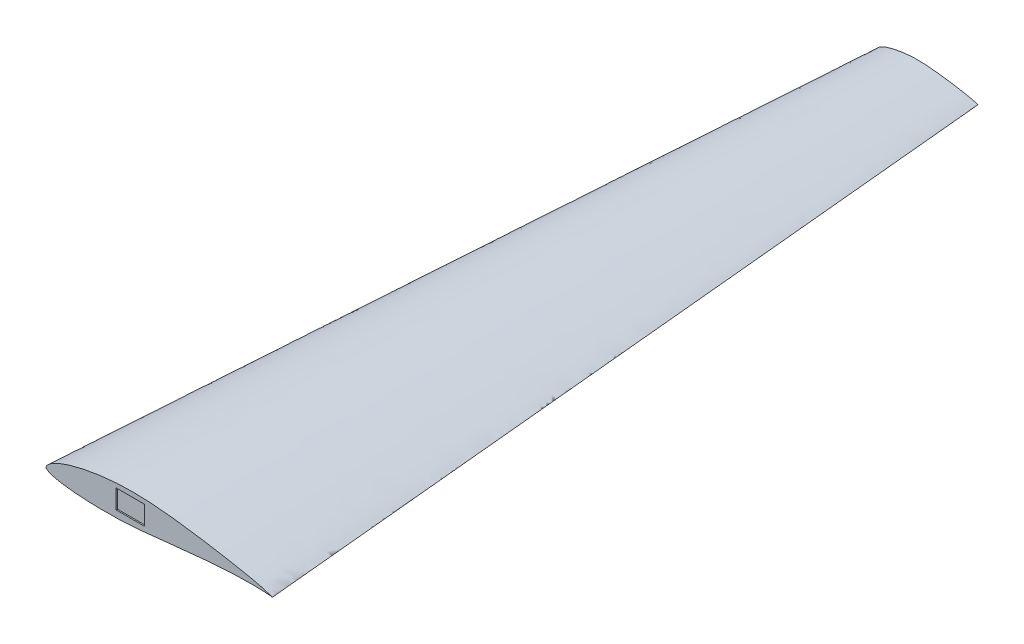
ISO-10303-21;
HEADER;
FILE_DESCRIPTION(('STEP AP214'),'2;1');
FILE_NAME('part.step','',(''),(''),'','','');
FILE_SCHEMA(('AUTOMOTIVE_DESIGN { 1 0 10303 214 1 1 1 1 }'));
ENDSEC;
DATA;
#1=APPLICATION_CONTEXT('core data for automotive mechanical design processes');
#2=APPLICATION_PROTOCOL_DEFINITION('international standard','automotive_design',2000,#1);
#3=PRODUCT_CONTEXT('',#1,'mechanical');
#4=PRODUCT('Part','Part','',(#3));
#5=PRODUCT_RELATED_PRODUCT_CATEGORY('part','',(#4));
#6=PRODUCT_DEFINITION_FORMATION('','',#4);
#7=PRODUCT_DEFINITION_CONTEXT('part definition',#1,'design');
#8=PRODUCT_DEFINITION('design','',#6,#7);
#9=PRODUCT_DEFINITION_SHAPE('','',#8);
#10=(LENGTH_UNIT() NAMED_UNIT(*) SI_UNIT(.MILLI.,.METRE.));
#11=(NAMED_UNIT(*) PLANE_ANGLE_UNIT() SI_UNIT($,.RADIAN.));
#12=(NAMED_UNIT(*) SI_UNIT($,.STERADIAN.) SOLID_ANGLE_UNIT());
#13=UNCERTAINTY_MEASURE_WITH_UNIT(LENGTH_MEASURE(1.E-05),#10,'distance_accuracy_value','');
#14=(GEOMETRIC_REPRESENTATION_CONTEXT(3) GLOBAL_UNCERTAINTY_ASSIGNED_CONTEXT((#13)) GLOBAL_UNIT_ASSIGNED_CONTEXT((#10,
#11,#12)) REPRESENTATION_CONTEXT('',''));
#15=CARTESIAN_POINT('',(0.,0.,0.));
#16=DIRECTION('',(0.,0.,1.));
#17=DIRECTION('',(1.,0.,0.));
#18=AXIS2_PLACEMENT_3D('',#15,#16,#17);
#19=CARTESIAN_POINT('',(-1154.67997113277,-18.9639866159089,-20.));
#20=DIRECTION('',(0.,0.,1.));
#21=DIRECTION('',(-1.,0.,0.));
#22=AXIS2_PLACEMENT_3D('',#19,#20,#21);
#23=PLANE('',#22);
#24=CARTESIAN_POINT('',(637.205898192704,-30.8287655417815,-20.));
#25=CARTESIAN_POINT('',(637.201899095165,-30.6617141837894,-20.));
#26=CARTESIAN_POINT('',(624.340560361227,-27.2829794764373,-20.));
#27=CARTESIAN_POINT('',(612.180848443958,-22.4384339408856,-20.));
#28=CARTESIAN_POINT('',(584.1934966163,-12.9236065949599,-20.));
#29=CARTESIAN_POINT('',(550.573388405335,-3.00306264153049,-20.));
#30=CARTESIAN_POINT('',(507.031775344727,7.31757291672287,-20.));
#31=CARTESIAN_POINT('',(455.545202677299,18.4127610030455,-20.));
#32=CARTESIAN_POINT('',(396.045342981437,30.4121098513646,-20.));
#33=CARTESIAN_POINT('',(329.608830024776,43.1367783526144,-20.));
#34=CARTESIAN_POINT('',(257.103677447065,56.3698310078444,-20.));
#35=CARTESIAN_POINT('',(179.566044984712,69.8811959522331,-20.));
#36=CARTESIAN_POINT('',(98.0040149305177,83.2871979527405,-20.));
#37=CARTESIAN_POINT('',(13.4916001870969,96.2741526462915,-20.));
#38=CARTESIAN_POINT('',(-72.9444245741009,108.416502290215,-20.));
#39=CARTESIAN_POINT('',(-160.276589340614,119.243860555077,-20.));
#40=CARTESIAN_POINT('',(-247.524811414299,128.361079009185,-20.));
#41=CARTESIAN_POINT('',(-333.850816491668,135.206641048699,-20.));
#42=CARTESIAN_POINT('',(-418.62279166819,139.050084763409,-20.));
#43=CARTESIAN_POINT('',(-501.360886667318,139.671030910781,-20.));
#44=CARTESIAN_POINT('',(-581.716263489697,136.885357982169,-20.));
#45=CARTESIAN_POINT('',(-659.296624774083,130.867982416211,-20.));
#46=CARTESIAN_POINT('',(-733.606389984446,122.220462802317,-20.));
#47=CARTESIAN_POINT('',(-804.005192472441,111.471174797557,-20.));
#48=CARTESIAN_POINT('',(-869.742959712326,98.8183249705576,-20.));
#49=CARTESIAN_POINT('',(-930.149362586197,84.6626316298686,-20.));
#50=CARTESIAN_POINT('',(-984.604323928922,69.3091730998716,-20.));
#51=CARTESIAN_POINT('',(-1032.52610252396,53.0958706696138,-20.));
#52=CARTESIAN_POINT('',(-1073.44710571588,36.391875667701,-20.));
#53=CARTESIAN_POINT('',(-1106.97281951812,19.4367425763099,-20.));
#54=CARTESIAN_POINT('',(-1132.81440521732,2.65228106861395,-20.));
#55=CARTESIAN_POINT('',(-1147.69800566304,-10.4496016700711,-20.));
#56=CARTESIAN_POINT('',(-1155.93792618086,-20.4072267704912,-20.));
#57=CARTESIAN_POINT('',(-1159.73603262891,-26.1420092113419,-20.));
#58=CARTESIAN_POINT('',(-1162.29687404882,-32.2887637968773,-20.));
#59=CARTESIAN_POINT('',(-1163.02961498736,-36.0635081413664,-20.));
#60=CARTESIAN_POINT('',(-1162.88645541477,-38.7085659438932,-20.));
#61=CARTESIAN_POINT('',(-1161.82222186532,-41.1953992990109,-20.));
#62=CARTESIAN_POINT('',(-1159.33848344514,-44.3902386327544,-20.));
#63=CARTESIAN_POINT('',(-1154.04337356053,-49.2444985030971,-20.));
#64=CARTESIAN_POINT('',(-1143.54648919571,-55.9865112754625,-20.));
#65=CARTESIAN_POINT('',(-1124.17422283292,-64.496278877395,-20.));
#66=CARTESIAN_POINT('',(-1094.69974337827,-73.384985572832,-20.));
#67=CARTESIAN_POINT('',(-1055.14192052983,-81.756543547593,-20.));
#68=CARTESIAN_POINT('',(-1007.21961769442,-89.0071543211266,-20.));
#69=CARTESIAN_POINT('',(-951.470022218796,-95.2724233138396,-20.));
#70=CARTESIAN_POINT('',(-888.557803111172,-100.396692502895,-20.));
#71=CARTESIAN_POINT('',(-819.285797118707,-104.232978137697,-20.));
#72=CARTESIAN_POINT('',(-744.520854987428,-106.629067947558,-20.));
#73=CARTESIAN_POINT('',(-665.068638724127,-107.227734162227,-20.));
#74=CARTESIAN_POINT('',(-581.618577699989,-105.540984685579,-20.));
#75=CARTESIAN_POINT('',(-494.657700858437,-101.259128330527,-20.));
#76=CARTESIAN_POINT('',(-404.474359226252,-94.1471454469288,-20.));
#77=CARTESIAN_POINT('',(-311.376736229075,-84.5975961097064,-20.));
#78=CARTESIAN_POINT('',(-215.89334635615,-74.0273472659613,-20.));
#79=CARTESIAN_POINT('',(-119.080288018422,-63.2442750785889,-20.));
#80=CARTESIAN_POINT('',(-22.3000935122685,-52.9711250135226,-20.));
#81=CARTESIAN_POINT('',(72.993589670017,-43.6696490132337,-20.));
#82=CARTESIAN_POINT('',(165.297776875109,-35.8584715469645,-20.));
#83=CARTESIAN_POINT('',(253.084648037599,-29.7869699753317,-20.));
#84=CARTESIAN_POINT('',(334.812275151983,-25.5512188260446,-20.));
#85=CARTESIAN_POINT('',(409.125030592602,-23.2680963711777,-20.));
#86=CARTESIAN_POINT('',(474.371672980515,-22.6259520258617,-20.));
#87=CARTESIAN_POINT('',(530.172780584082,-23.5565126327113,-20.));
#88=CARTESIAN_POINT('',(573.20612192453,-25.027782672938,-20.));
#89=CARTESIAN_POINT('',(608.39684892439,-27.7924208570704,-20.));
#90=CARTESIAN_POINT('',(622.966968367519,-28.6400352563432,-20.));
#91=CARTESIAN_POINT('',(637.210029137364,-31.001324452546,-20.));
#92=CARTESIAN_POINT('',(637.205898192704,-30.8287655417815,-20.));
#93=B_SPLINE_CURVE_WITH_KNOTS('',3,(#24,#25,#26,#27,#28,#29,#30,#31,#32,#33,#34,#35,#36,#37,#38,
#39,#40,#41,#42,#43,#44,#45,#46,#47,#48,#49,#50,#51,#52,#53,#54,#55,#56,#57,#58,#59,#60,#61,#62,
#63,#64,#65,#66,#67,#68,#69,#70,#71,#72,#73,#74,#75,#76,#77,#78,#79,#80,#81,#82,#83,#84,#85,#86,
#87,#88,#89,#90,#91,#92),.UNSPECIFIED.,.T.,.F.,(4,1,1,1,1,1,1,1,1,1,1,1,1,1,1,1,1,1,1,1,1,1,1,1,
1,1,1,1,1,1,1,1,1,1,1,1,1,1,1,1,1,1,1,1,1,1,1,1,1,1,1,1,1,1,1,1,1,1,1,1,1,1,1,1,1,1,4),(0.,
0.00178025429931348,0.00677661855276226,0.014307631931115,0.0240462466109695,0.0361164032384218,
0.0505469730630571,0.0671298835400742,0.0856244289456062,0.10576729194862,0.127282098412942,
0.149864114045041,0.173229760189317,0.197069077892929,0.221103034083199,0.245051957369849,
0.268663179942347,0.291772797822348,0.314298508345449,0.336177511433891,0.357377359215959,
0.377791670496789,0.397224888102935,0.415489312865215,0.432417328029751,0.447849235180273,
0.461650757544391,0.473686992386839,0.483898395757803,0.492262508108233,0.498796820958936,
0.499955027372734,0.502810607326279,0.504371243067385,0.50535998755193,0.505924933279694,
0.506503368203689,0.507535007041587,0.509204749770686,0.512345281497249,0.517665407870953,
0.526421681932562,0.537424925562334,0.550643204547595,0.565965823835836,0.583206168779579,
0.6021549785986,0.622586582637333,0.644254823208852,0.666997978581174,0.690702845759673,
0.715307475272001,0.740824202204505,0.767084355637659,0.793717038600972,0.82033109971691,
0.846519300878587,0.871863223081629,0.895937170924907,0.918334876492831,0.938667169413558,
0.956573464196435,0.971715275283217,0.983839006179547,0.992717916559063,0.998161052107173,1.),.UNSPECIFIED.);
#94=CARTESIAN_POINT('',(637.205898192704,-30.8287655417815,-20.));
#95=VERTEX_POINT('',#94);
#96=EDGE_CURVE('E63',#95,#95,#93,.T.);
#97=ORIENTED_EDGE('',*,*,#96,.T.);
#98=EDGE_LOOP('',(#97));
#99=FACE_BOUND('',#98,.T.);
#100=DIRECTION('',(-1.,0.,0.));
#101=VECTOR('',#100,1.);
#102=CARTESIAN_POINT('',(-378.662123766315,-50.9305698518282,-20.));
#103=LINE('',#102,#101);
#104=CARTESIAN_POINT('',(-378.662123766315,-50.9305698518282,-20.));
#105=VERTEX_POINT('',#104);
#106=CARTESIAN_POINT('',(-605.033690274723,-50.9305698518282,-20.));
#107=VERTEX_POINT('',#106);
#108=EDGE_CURVE('E101',#105,#107,#103,.T.);
#109=ORIENTED_EDGE('',*,*,#108,.T.);
#110=DIRECTION('',(0.,1.,0.));
#111=VECTOR('',#110,1.);
#112=CARTESIAN_POINT('',(-605.033690274723,100.87153945381,-20.));
#113=LINE('',#112,#111);
#114=CARTESIAN_POINT('',(-605.033690274723,100.87153945381,-20.));
#115=VERTEX_POINT('',#114);
#116=EDGE_CURVE('E78',#107,#115,#113,.T.);
#117=ORIENTED_EDGE('',*,*,#116,.T.);
#118=DIRECTION('',(1.,0.,0.));
#119=VECTOR('',#118,1.);
#120=CARTESIAN_POINT('',(-378.662123766315,100.87153945381,-20.));
#121=LINE('',#120,#119);
#122=CARTESIAN_POINT('',(-378.662123766315,100.87153945381,-20.));
#123=VERTEX_POINT('',#122);
#124=EDGE_CURVE('E141',#115,#123,#121,.T.);
#125=ORIENTED_EDGE('',*,*,#124,.T.);
#126=DIRECTION('',(0.,-1.,0.));
#127=VECTOR('',#126,1.);
#128=CARTESIAN_POINT('',(-378.662123766315,100.87153945381,-20.));
#129=LINE('',#128,#127);
#130=EDGE_CURVE('E129',#123,#105,#129,.T.);
#131=ORIENTED_EDGE('',*,*,#130,.T.);
#132=EDGE_LOOP('',(#109,#117,#125,#131));
#133=FACE_BOUND('',#132,.T.);
#134=ADVANCED_FACE('F50',(#99,#133),#23,.T.);
#135=CARTESIAN_POINT('',(-747.653077521207,-40.6182657315667,-6220.));
#136=DIRECTION('',(0.,0.,1.));
#137=DIRECTION('',(-1.,0.,0.));
#138=AXIS2_PLACEMENT_3D('',#135,#136,#137);
#139=PLANE('',#138);
#140=CARTESIAN_POINT('',(46.231204019507,-35.2354448345607,-6220.));
#141=CARTESIAN_POINT('',(46.2284405656363,-35.161464044046,-6220.));
#142=CARTESIAN_POINT('',(40.5107466597847,-33.7410304315181,-6220.));
#143=CARTESIAN_POINT('',(35.095173755005,-31.6670699807893,-6220.));
#144=CARTESIAN_POINT('',(22.6401533138637,-27.6181263346662,-6220.));
#145=CARTESIAN_POINT('',(7.68738653694873,-23.4228917248776,-6220.));
#146=CARTESIAN_POINT('',(-11.6630288456523,-19.1093216631822,-6220.));
#147=CARTESIAN_POINT('',(-34.5376973183015,-14.4997928532483,-6220.));
#148=CARTESIAN_POINT('',(-60.9676577726097,-9.5372939208794,-6220.));
#149=CARTESIAN_POINT('',(-90.4748945702333,-4.29466001199642,-6220.));
#150=CARTESIAN_POINT('',(-122.673585589033,1.13715909285272,-6220.));
#151=CARTESIAN_POINT('',(-157.103341203516,6.66239247620247,-6220.));
#152=CARTESIAN_POINT('',(-193.315298237174,12.1170555043395,-6220.));
#153=CARTESIAN_POINT('',(-230.831801501577,17.3685612770775,-6220.));
#154=CARTESIAN_POINT('',(-269.195458339637,22.2344819950382,-6220.));
#155=CARTESIAN_POINT('',(-307.948301893932,26.5125347132972,-6220.));
#156=CARTESIAN_POINT('',(-346.653804819708,30.0334858752315,-6220.));
#157=CARTESIAN_POINT('',(-384.937273776908,32.5535580846316,-6220.));
#158=CARTESIAN_POINT('',(-422.514475712798,33.7529045585345,-6220.));
#159=CARTESIAN_POINT('',(-459.17152624748,33.5367452774346,-6220.));
#160=CARTESIAN_POINT('',(-494.752795326995,31.8255847079449,-6220.));
#161=CARTESIAN_POINT('',(-529.085531914352,28.6992408412461,-6220.));
#162=CARTESIAN_POINT('',(-561.953763146873,24.4271493642645,-6220.));
#163=CARTESIAN_POINT('',(-593.076940726259,19.2471852213284,-6220.));
#164=CARTESIAN_POINT('',(-622.123955821754,13.2516082607377,-6220.));
#165=CARTESIAN_POINT('',(-648.800228679982,6.62191851956731,-6220.));
#166=CARTESIAN_POINT('',(-672.832873554333,-0.503051287442359,-6220.));
#167=CARTESIAN_POINT('',(-693.96618270177,-7.97014647053786,-6220.));
#168=CARTESIAN_POINT('',(-711.995202148996,-15.6130550209624,-6220.));
#169=CARTESIAN_POINT('',(-726.74658265942,-23.3233108305785,-6220.));
#170=CARTESIAN_POINT('',(-738.094871742379,-30.9123353139702,-6220.));
#171=CARTESIAN_POINT('',(-744.610586604553,-36.8048992419908,-6220.));
#172=CARTESIAN_POINT('',(-748.201788544685,-41.2650967461758,-6220.));
#173=CARTESIAN_POINT('',(-749.850318344285,-43.828182757875,-6220.));
#174=CARTESIAN_POINT('',(-750.94828793429,-46.5664283398626,-6220.));
#175=CARTESIAN_POINT('',(-751.250483793828,-48.2430082792743,-6220.));
#176=CARTESIAN_POINT('',(-751.171358916499,-49.4139312981977,-6220.));
#177=CARTESIAN_POINT('',(-750.685133378202,-50.5092914480428,-6220.));
#178=CARTESIAN_POINT('',(-749.565856882824,-51.9098735302076,-6220.));
#179=CARTESIAN_POINT('',(-747.191277168439,-54.0288947151431,-6220.));
#180=CARTESIAN_POINT('',(-742.501078818877,-56.9533147580623,-6220.));
#181=CARTESIAN_POINT('',(-733.868548954772,-60.6081626209987,-6220.));
#182=CARTESIAN_POINT('',(-720.75844147582,-64.3709023541952,-6220.));
#183=CARTESIAN_POINT('',(-703.184436093652,-67.8446748921428,-6220.));
#184=CARTESIAN_POINT('',(-681.911582287878,-70.772200095514,-6220.));
#185=CARTESIAN_POINT('',(-657.177051439535,-73.2167412462913,-6220.));
#186=CARTESIAN_POINT('',(-629.276219223052,-75.1132874538173,-6220.));
#187=CARTESIAN_POINT('',(-598.56561876685,-76.4014909147392,-6220.));
#188=CARTESIAN_POINT('',(-565.43017274413,-77.0190676374616,-6220.));
#189=CARTESIAN_POINT('',(-530.228914169513,-76.8125475071701,-6220.));
#190=CARTESIAN_POINT('',(-493.270160843118,-75.5698410912889,-6220.));
#191=CARTESIAN_POINT('',(-454.771507600199,-73.1566453823038,-6220.));
#192=CARTESIAN_POINT('',(-414.862090680234,-69.4705576020164,-6220.));
#193=CARTESIAN_POINT('',(-373.676106035862,-64.6873134822189,-6220.));
#194=CARTESIAN_POINT('',(-331.439275690689,-59.4377296716919,-6220.));
#195=CARTESIAN_POINT('',(-288.614659582081,-54.0859694749774,-6220.));
#196=CARTESIAN_POINT('',(-245.801574741511,-48.9603022904963,-6220.));
#197=CARTESIAN_POINT('',(-203.641252257449,-44.2739171415237,-6220.));
#198=CARTESIAN_POINT('',(-162.796442142331,-40.2654907769843,-6220.));
#199=CARTESIAN_POINT('',(-123.942495214821,-37.0545696704387,-6220.));
#200=CARTESIAN_POINT('',(-87.7619223828843,-34.6928701852552,-6220.));
#201=CARTESIAN_POINT('',(-54.8545790950461,-33.2402187187982,-6220.));
#202=CARTESIAN_POINT('',(-25.9538233844276,-32.5683565258773,-6220.));
#203=CARTESIAN_POINT('',(-1.22814621466564,-32.6492910205264,-6220.));
#204=CARTESIAN_POINT('',(17.844561028956,-33.0455684548176,-6220.));
#205=CARTESIAN_POINT('',(33.4506324915198,-34.0613780335465,-6220.));
#206=CARTESIAN_POINT('',(39.9102962245878,-34.3503679361492,-6220.));
#207=CARTESIAN_POINT('',(46.2340585822929,-35.311864713945,-6220.));
#208=CARTESIAN_POINT('',(46.231204019507,-35.2354448345607,-6220.));
#209=B_SPLINE_CURVE_WITH_KNOTS('',3,(#140,#141,#142,#143,#144,#145,#146,#147,#148,#149,#150,
#151,#152,#153,#154,#155,#156,#157,#158,#159,#160,#161,#162,#163,#164,#165,#166,#167,#168,#169,
#170,#171,#172,#173,#174,#175,#176,#177,#178,#179,#180,#181,#182,#183,#184,#185,#186,#187,#188,
#189,#190,#191,#192,#193,#194,#195,#196,#197,#198,#199,#200,#201,#202,#203,#204,#205,#206,#207,
#208),.UNSPECIFIED.,.T.,.F.,(4,1,1,1,1,1,1,1,1,1,1,1,1,1,1,1,1,1,1,1,1,1,1,1,1,1,1,1,1,1,1,1,1,
1,1,1,1,1,1,1,1,1,1,1,1,1,1,1,1,1,1,1,1,1,1,1,1,1,1,1,1,1,1,1,1,1,4),(0.,0.00178025429931348,
0.00677661855276226,0.014307631931115,0.0240462466109695,0.0361164032384218,0.0505469730630571,
0.0671298835400742,0.0856244289456062,0.10576729194862,0.127282098412942,0.149864114045041,
0.173229760189317,0.197069077892929,0.221103034083199,0.245051957369849,0.268663179942347,
0.291772797822348,0.314298508345449,0.336177511433891,0.357377359215959,0.377791670496789,
0.397224888102935,0.415489312865215,0.432417328029751,0.447849235180273,0.461650757544391,
0.473686992386839,0.483898395757803,0.492262508108233,0.498796820958936,0.499955027372734,
0.502810607326279,0.504371243067385,0.50535998755193,0.505924933279694,0.506503368203689,
0.507535007041587,0.509204749770686,0.512345281497249,0.517665407870953,0.526421681932562,
0.537424925562334,0.550643204547595,0.565965823835836,0.583206168779579,0.6021549785986,
0.622586582637333,0.644254823208852,0.666997978581174,0.690702845759673,0.715307475272001,
0.740824202204505,0.767084355637659,0.793717038600972,0.82033109971691,0.846519300878587,
0.871863223081629,0.895937170924907,0.918334876492831,0.938667169413558,0.956573464196435,
0.971715275283217,0.983839006179547,0.992717916559063,0.998161052107173,1.),.UNSPECIFIED.);
#210=CARTESIAN_POINT('',(46.231204019507,-35.2354448345607,-6220.));
#211=VERTEX_POINT('',#210);
#212=EDGE_CURVE('E12',#211,#211,#209,.T.);
#213=ORIENTED_EDGE('',*,*,#212,.F.);
#214=EDGE_LOOP('',(#213));
#215=FACE_BOUND('',#214,.T.);
#216=ADVANCED_FACE('F52',(#215),#139,.F.);
#217=CARTESIAN_POINT('',(-1162.90430000894,-36.010271297111,-20.));
#218=CARTESIAN_POINT('',(-751.127407137551,-47.6464509229914,-6220.));
#219=CARTESIAN_POINT('',(-1162.92051700588,-36.2047277608436,-20.));
#220=CARTESIAN_POINT('',(-751.14142513213,-47.7317010378396,-6220.));
#221=CARTESIAN_POINT('',(-1162.95828590428,-36.8333009797402,-20.));
#222=CARTESIAN_POINT('',(-751.181479745274,-48.0073492187059,-6220.));
#223=CARTESIAN_POINT('',(-1162.93950422828,-37.7284206728293,-20.));
#224=CARTESIAN_POINT('',(-751.212003010877,-48.4002126372902,-6220.));
#225=CARTESIAN_POINT('',(-1162.75806646853,-38.8399966686517,-20.));
#226=CARTESIAN_POINT('',(-751.205936581557,-48.9022365528266,-6220.));
#227=CARTESIAN_POINT('',(-1162.43715617724,-39.7584598613452,-20.));
#228=CARTESIAN_POINT('',(-751.149350948429,-49.3294659917411,-6220.));
#229=CARTESIAN_POINT('',(-1161.92646618367,-40.7891683470772,-20.));
#230=CARTESIAN_POINT('',(-750.994737816625,-49.8118201361654,-6220.));
#231=CARTESIAN_POINT('',(-1161.11663317046,-42.1029999132474,-20.));
#232=CARTESIAN_POINT('',(-750.693102250106,-50.4312829941758,-6220.));
#233=CARTESIAN_POINT('',(-1160.04083173092,-43.4261323472656,-20.));
#234=CARTESIAN_POINT('',(-750.256246487288,-51.0459696479064,-6220.));
#235=CARTESIAN_POINT('',(-1158.08316926316,-45.5410402952428,-20.));
#236=CARTESIAN_POINT('',(-749.416488376659,-52.0107554517047,-6220.));
#237=CARTESIAN_POINT('',(-1156.23019430949,-47.1974871194794,-20.));
#238=CARTESIAN_POINT('',(-748.611427802237,-52.7615844367858,-6220.));
#239=CARTESIAN_POINT('',(-1151.94713749663,-50.5908837566148,-20.));
#240=CARTESIAN_POINT('',(-746.730863479948,-54.2879264972246,-6220.));
#241=CARTESIAN_POINT('',(-1148.31391783736,-52.8911267648315,-20.));
#242=CARTESIAN_POINT('',(-745.127778881206,-55.3155216976197,-6220.));
#243=CARTESIAN_POINT('',(-1139.61526846819,-57.7134013644461,-20.));
#244=CARTESIAN_POINT('',(-741.271616253597,-57.4518931681089,-6220.));
#245=CARTESIAN_POINT('',(-1133.22446961501,-60.4976797618334,-20.));
#246=CARTESIAN_POINT('',(-738.436071417425,-58.6743610617412,-6220.));
#247=CARTESIAN_POINT('',(-1117.50660530661,-66.5070521851947,-20.));
#248=CARTESIAN_POINT('',(-731.452005928495,-61.2861024299933,-6220.));
#249=CARTESIAN_POINT('',(-1106.79674918026,-69.7192819064195,-20.));
#250=CARTESIAN_POINT('',(-726.694952758834,-62.6670607253582,-6220.));
#251=CARTESIAN_POINT('',(-1083.77253774689,-75.6974924010188,-20.));
#252=CARTESIAN_POINT('',(-716.466679165266,-65.2097515079323,-6220.));
#253=CARTESIAN_POINT('',(-1070.14798292222,-78.5687239096391,-20.));
#254=CARTESIAN_POINT('',(-710.416790483915,-66.4150887779212,-6220.));
#255=CARTESIAN_POINT('',(-1041.37927458624,-83.8388222163296,-20.));
#256=CARTESIAN_POINT('',(-697.644342595635,-68.6007561784582,-6220.));
#257=CARTESIAN_POINT('',(-1024.93131069943,-86.3194258730443,-20.));
#258=CARTESIAN_POINT('',(-690.344479221008,-69.6116826334672,-6220.));
#259=CARTESIAN_POINT('',(-990.692971942089,-90.8644571464163,-20.));
#260=CARTESIAN_POINT('',(-675.151371615518,-71.4362702565338,-6220.));
#261=CARTESIAN_POINT('',(-971.603180748062,-93.003387014006,-20.));
#262=CARTESIAN_POINT('',(-666.682488130611,-72.2773083825788,-6220.));
#263=CARTESIAN_POINT('',(-932.324743638965,-96.8318272346373,-20.));
#264=CARTESIAN_POINT('',(-649.260178746018,-73.7517046735597,-6220.));
#265=CARTESIAN_POINT('',(-910.836949284791,-98.5765530297146,-20.));
#266=CARTESIAN_POINT('',(-639.73101548564,-74.4026274975686,-6220.));
#267=CARTESIAN_POINT('',(-867.03305601999,-101.58873360053,-20.));
#268=CARTESIAN_POINT('',(-620.308326956115,-75.486802895482,-6220.));
#269=CARTESIAN_POINT('',(-843.417892861192,-102.891593827696,-20.));
#270=CARTESIAN_POINT('',(-609.839170905086,-75.9286043978483,-6220.));
#271=CARTESIAN_POINT('',(-795.646920766998,-104.990564101496,-20.));
#272=CARTESIAN_POINT('',(-588.664210241904,-76.5836753733088,-6220.));
#273=CARTESIAN_POINT('',(-770.191990263446,-105.801112322982,-20.));
#274=CARTESIAN_POINT('',(-577.382832209052,-76.7962945908848,-6220.));
#275=CARTESIAN_POINT('',(-719.053076037356,-106.820965663407,-20.));
#276=CARTESIAN_POINT('',(-554.722067026049,-76.9537868757262,-6220.));
#277=CARTESIAN_POINT('',(-692.070077807331,-107.018325104336,-20.));
#278=CARTESIAN_POINT('',(-542.767268643542,-76.8861080190515,-6220.));
#279=CARTESIAN_POINT('',(-638.089774283471,-106.682418977105,-20.));
#280=CARTESIAN_POINT('',(-518.85553536317,-76.4273586963049,-6220.));
#281=CARTESIAN_POINT('',(-609.794232768652,-106.104249085647,-20.));
#282=CARTESIAN_POINT('',(-506.323726287629,-76.00875604561,-6220.));
#283=CARTESIAN_POINT('',(-553.350969112621,-104.149119241392,-20.));
#284=CARTESIAN_POINT('',(-481.330177815911,-74.8185266368609,-6220.));
#285=CARTESIAN_POINT('',(-523.906737864093,-102.692951447115,-20.));
#286=CARTESIAN_POINT('',(-468.294534369807,-74.0043038696539,-6220.));
#287=CARTESIAN_POINT('',(-465.269139856987,-98.9415058180637,-20.));
#288=CARTESIAN_POINT('',(-442.339202583138,-72.0054456539621,-6220.));
#289=CARTESIAN_POINT('',(-434.781940137164,-96.5321580641996,-20.));
#290=CARTESIAN_POINT('',(-428.847066353092,-70.7622288894901,-6220.));
#291=CARTESIAN_POINT('',(-374.05437274898,-91.0267955137071,-20.));
#292=CARTESIAN_POINT('',(-401.976193920792,-67.9716757541424,-6220.));
#293=CARTESIAN_POINT('',(-342.52286999739,-87.7906840748762,-20.));
#294=CARTESIAN_POINT('',(-388.026457907883,-66.3539298518788,-6220.));
#295=CARTESIAN_POINT('',(-279.873455725877,-81.1101045705363,-20.));
#296=CARTESIAN_POINT('',(-360.311756195002,-63.0254702980006,-6220.));
#297=CARTESIAN_POINT('',(-247.464881019271,-77.5222479783369,-20.));
#298=CARTESIAN_POINT('',(-345.97580160877,-61.2444635221544,-6220.));
#299=CARTESIAN_POINT('',(-183.486970194721,-70.4179137920097,-20.));
#300=CARTESIAN_POINT('',(-317.67543865908,-57.7176072400212,-6220.));
#301=CARTESIAN_POINT('',(-150.6268530791,-66.7590836881734,-20.));
#302=CARTESIAN_POINT('',(-303.140030241952,-55.9011941659093,-6220.));
#303=CARTESIAN_POINT('',(-86.2016943412436,-59.7542353189301,-20.));
#304=CARTESIAN_POINT('',(-274.641213520155,-52.4135466090698,-6220.));
#305=CARTESIAN_POINT('',(-53.345595564522,-56.2684626551629,-20.));
#306=CARTESIAN_POINT('',(-260.106661836917,-50.6729356073692,-6220.));
#307=CARTESIAN_POINT('',(10.5846824035014,-49.7612904920643,-20.));
#308=CARTESIAN_POINT('',(-231.824260001459,-47.4074556833747,-6220.));
#309=CARTESIAN_POINT('',(42.9504124742033,-46.6050038311394,-20.));
#310=CARTESIAN_POINT('',(-217.505056961184,-45.8149662759653,-6220.));
#311=CARTESIAN_POINT('',(105.396969886383,-40.9275355616019,-20.));
#312=CARTESIAN_POINT('',(-189.875157787999,-42.9241781081205,-6220.));
#313=CARTESIAN_POINT('',(136.769888645999,-38.2760966996364,-20.));
#314=CARTESIAN_POINT('',(-175.992823604059,-41.5605567405333,-6220.));
#315=CARTESIAN_POINT('',(196.709894193326,-33.6859517027061,-20.));
#316=CARTESIAN_POINT('',(-149.466929054913,-39.1653912946596,-6220.));
#317=CARTESIAN_POINT('',(226.569789574539,-31.6247246782842,-20.));
#318=CARTESIAN_POINT('',(-136.251337683896,-38.0717822114152,-6220.));
#319=CARTESIAN_POINT('',(282.968833424865,-28.2381427663579,-20.));
#320=CARTESIAN_POINT('',(-111.286803426713,-36.2300900327708,-6220.));
#321=CARTESIAN_POINT('',(310.802717242567,-26.8004433482933,-20.));
#322=CARTESIAN_POINT('',(-98.9651052741872,-35.4241618480409,-6220.));
#323=CARTESIAN_POINT('',(362.694757549873,-24.6945809408982,-20.));
#324=CARTESIAN_POINT('',(-75.9899672258875,-34.1751701427918,-6220.));
#325=CARTESIAN_POINT('',(388.045353538575,-23.9206087221476,-20.));
#326=CARTESIAN_POINT('',(-64.7640727036485,-33.6776603042969,-6220.));
#327=CARTESIAN_POINT('',(434.408953615054,-23.0192570807243,-20.));
#328=CARTESIAN_POINT('',(-44.2292297655829,-32.9951221570591,-6220.));
#329=CARTESIAN_POINT('',(456.730129024212,-22.8059711790784,-20.));
#330=CARTESIAN_POINT('',(-34.3430563613789,-32.763382860872,-6220.));
#331=CARTESIAN_POINT('',(496.927894664348,-23.0021082033961,-20.));
#332=CARTESIAN_POINT('',(-16.5382582317236,-32.6015550028647,-6220.));
#333=CARTESIAN_POINT('',(516.060151013691,-23.3253514997068,-20.));
#334=CARTESIAN_POINT('',(-8.05769346037086,-32.6269358813236,-6220.));
#335=CARTESIAN_POINT('',(548.621162876869,-24.1872457180949,-20.));
#336=CARTESIAN_POINT('',(6.38583708555751,-32.8090373118029,-6220.));
#337=CARTESIAN_POINT('',(563.505640747982,-24.7085251611544,-20.));
#338=CARTESIAN_POINT('',(12.9729042702342,-32.9443490727743,-6220.));
#339=CARTESIAN_POINT('',(589.809000037014,-26.3321305710775,-20.));
#340=CARTESIAN_POINT('',(24.5916797934128,-33.4883744378349,-6220.));
#341=CARTESIAN_POINT('',(601.996348163368,-27.285401619129,-20.));
#342=CARTESIAN_POINT('',(30.03006042549,-33.8387307210732,-6220.));
#343=CARTESIAN_POINT('',(616.720254094529,-28.2766336393148,-20.));
#344=CARTESIAN_POINT('',(36.6899311496249,-34.2045790935945,-6220.));
#345=CARTESIAN_POINT('',(622.242609223136,-28.6570872428781,-20.));
#346=CARTESIAN_POINT('',(39.0340366974602,-34.3111661810945,-6220.));
#347=CARTESIAN_POINT('',(634.304255826598,-30.5195901374152,-20.));
#348=CARTESIAN_POINT('',(44.0733446394874,-34.9879008816027,-6220.));
#349=CARTESIAN_POINT('',(637.767352204719,-31.0543550713085,-20.));
#350=CARTESIAN_POINT('',(45.9272473515707,-35.2652155843534,-6220.));
#351=CARTESIAN_POINT('',(636.531359390657,-30.4855602219704,-20.));
#352=CARTESIAN_POINT('',(46.4680358961861,-35.2384187687712,-6220.));
#353=CARTESIAN_POINT('',(632.598653887573,-29.4395907888475,-20.));
#354=CARTESIAN_POINT('',(45.0244696021425,-34.8623642927802,-6220.));
#355=CARTESIAN_POINT('',(622.527298587213,-26.5605586418112,-20.));
#356=CARTESIAN_POINT('',(40.2341206243334,-33.6034333426219,-6220.));
#357=CARTESIAN_POINT('',(617.919324192789,-24.7357804732159,-20.));
#358=CARTESIAN_POINT('',(38.0794627096275,-32.8099402503357,-6220.));
#359=CARTESIAN_POINT('',(605.456552961758,-20.1523830515375,-20.));
#360=CARTESIAN_POINT('',(32.6553805949656,-30.8788003993694,-6220.));
#361=CARTESIAN_POINT('',(595.564232461683,-16.79759966716,-20.));
#362=CARTESIAN_POINT('',(28.2853129879629,-29.453284574816,-6220.));
#363=CARTESIAN_POINT('',(575.158949053144,-10.2577131469904,-20.));
#364=CARTESIAN_POINT('',(19.1724246219445,-26.6503419030121,-6220.));
#365=CARTESIAN_POINT('',(563.585645312604,-6.85409211465511,-20.));
#366=CARTESIAN_POINT('',(14.0188966510992,-25.1992967714753,-6220.));
#367=CARTESIAN_POINT('',(538.447932921229,-0.128975113925972,-20.));
#368=CARTESIAN_POINT('',(2.85974978337416,-22.3526340151024,-6220.));
#369=CARTESIAN_POINT('',(523.522197451257,3.40459866594387,-20.));
#370=CARTESIAN_POINT('',(-3.76900719014392,-20.8690469613892,-6220.));
#371=CARTESIAN_POINT('',(492.185268141761,10.5169466817212,-20.));
#372=CARTESIAN_POINT('',(-17.6957510629968,-17.8959063334472,-6220.));
#373=CARTESIAN_POINT('',(474.516835378577,14.3216375678992,-20.));
#374=CARTESIAN_POINT('',(-25.5456443902167,-16.3118028101146,-6220.));
#375=CARTESIAN_POINT('',(437.777607591648,21.9959555301955,-20.));
#376=CARTESIAN_POINT('',(-41.8648224263828,-13.1254579178056,-6220.));
#377=CARTESIAN_POINT('',(417.423060215335,26.0987804042736,-20.));
#378=CARTESIAN_POINT('',(-50.9056937233297,-11.4265319293285,-6220.));
#379=CARTESIAN_POINT('',(375.669090054576,34.314799084333,-20.));
#380=CARTESIAN_POINT('',(-69.4513275639072,-8.03099873418249,-6220.));
#381=CARTESIAN_POINT('',(352.992529576206,38.656195410745,-20.));
#382=CARTESIAN_POINT('',(-79.5226702293248,-6.24057257240141,-6220.));
#383=CARTESIAN_POINT('',(306.890358802446,47.2831695433537,-20.));
#384=CARTESIAN_POINT('',(-99.9967162284235,-2.68925721914329,-6220.));
#385=CARTESIAN_POINT('',(282.184783563856,51.79049854431,-20.));
#386=CARTESIAN_POINT('',(-110.967871891671,-0.837558427809834,-6220.));
#387=CARTESIAN_POINT('',(232.364695015218,60.6807366851849,-20.));
#388=CARTESIAN_POINT('',(-133.090718616217,2.8080684098029,-6220.));
#389=CARTESIAN_POINT('',(205.969420457569,65.2781655661902,-20.));
#390=CARTESIAN_POINT('',(-144.81097819915,4.6897332684965,-6220.));
#391=CARTESIAN_POINT('',(153.127527157508,74.2267820374059,-20.));
#392=CARTESIAN_POINT('',(-168.272744518702,8.34388715992015,-6220.));
#393=CARTESIAN_POINT('',(125.398401007479,78.7822154416607,-20.));
#394=CARTESIAN_POINT('',(-180.583631154224,10.1992648237815,-6220.));
#395=CARTESIAN_POINT('',(70.2292143511872,87.5553291834158,-20.));
#396=CARTESIAN_POINT('',(-205.075357182463,13.762168612102,-6220.));
#397=CARTESIAN_POINT('',(41.5050209986746,91.9665114871112,-20.));
#398=CARTESIAN_POINT('',(-217.82618550289,15.5480539922229,-6220.));
#399=CARTESIAN_POINT('',(-15.2872184466814,100.3169401201,-20.));
#400=CARTESIAN_POINT('',(-243.034336984895,18.9150117197281,-6220.));
#401=CARTESIAN_POINT('',(-44.6412234668813,104.436946686601,-20.));
#402=CARTESIAN_POINT('',(-256.062404549643,20.5687284200707,-6220.));
#403=CARTESIAN_POINT('',(-102.361433621519,112.063594938023,-20.));
#404=CARTESIAN_POINT('',(-281.67727664949,23.6107968641405,-6220.));
#405=CARTESIAN_POINT('',(-132.015598336515,115.735826760128,-20.));
#406=CARTESIAN_POINT('',(-294.835635649197,25.0649847446526,-6220.));
#407=CARTESIAN_POINT('',(-189.996150467315,122.349479497358,-20.));
#408=CARTESIAN_POINT('',(-320.55981726333,27.6578998973982,-6220.));
#409=CARTESIAN_POINT('',(-219.612607883501,125.43876740311,-20.));
#410=CARTESIAN_POINT('',(-333.698000986181,28.8549260035531,-6220.));
#411=CARTESIAN_POINT('',(-277.210978204034,130.71516102992,-20.));
#412=CARTESIAN_POINT('',(-359.244905506049,30.8598960825497,-6220.));
#413=CARTESIAN_POINT('',(-306.485112567445,133.029035132263,-20.));
#414=CARTESIAN_POINT('',(-372.226857307811,31.7168740487757,-6220.));
#415=CARTESIAN_POINT('',(-363.188312970001,136.536762426787,-20.));
#416=CARTESIAN_POINT('',(-397.366811804777,32.9470106612055,-6220.));
#417=CARTESIAN_POINT('',(-391.911975766159,137.830631342756,-20.));
#418=CARTESIAN_POINT('',(-410.098991871917,33.356641239308,-6220.));
#419=CARTESIAN_POINT('',(-447.376355624073,139.265879129497,-20.));
#420=CARTESIAN_POINT('',(-434.678287394496,33.6775423486159,-6220.));
#421=CARTESIAN_POINT('',(-475.414229911228,139.466899337259,-20.));
#422=CARTESIAN_POINT('',(-447.100446371808,33.6079260164729,-6220.));
#423=CARTESIAN_POINT('',(-529.384121299908,138.699551848954,-20.));
#424=CARTESIAN_POINT('',(-471.005220483377,32.9635913100783,-6220.));
#425=CARTESIAN_POINT('',(-556.61469756626,137.745994937191,-20.));
#426=CARTESIAN_POINT('',(-483.063233533356,32.3877545724089,-6220.));
#427=CARTESIAN_POINT('',(-608.881245275119,134.778356997137,-20.));
#428=CARTESIAN_POINT('',(-506.201080549589,30.7789828114937,-6220.));
#429=CARTESIAN_POINT('',(-635.215542093473,132.72714238374,-20.));
#430=CARTESIAN_POINT('',(-517.855832222937,29.7218188890459,-6220.));
#431=CARTESIAN_POINT('',(-685.53214717684,127.814922109583,-20.));
#432=CARTESIAN_POINT('',(-540.118788289106,27.2614685732158,-6220.));
#433=CARTESIAN_POINT('',(-710.810406809436,124.865157821797,-20.));
#434=CARTESIAN_POINT('',(-551.300593788726,25.8118090283584,-6220.));
#435=CARTESIAN_POINT('',(-758.764990157363,118.378962244102,-20.));
#436=CARTESIAN_POINT('',(-572.508172184002,22.6670900594036,-6220.));
#437=CARTESIAN_POINT('',(-782.733574385118,114.710288619701,-20.));
#438=CARTESIAN_POINT('',(-583.105791709451,20.9067263860822,-6220.));
#439=CARTESIAN_POINT('',(-827.816748447316,106.888055313169,-20.));
#440=CARTESIAN_POINT('',(-603.034084244006,17.1882015011721,-6220.));
#441=CARTESIAN_POINT('',(-850.219846888907,102.566690899999,-20.));
#442=CARTESIAN_POINT('',(-612.934669547302,15.1483633280053,-6220.));
#443=CARTESIAN_POINT('',(-891.958163011478,93.6123933069808,-20.));
#444=CARTESIAN_POINT('',(-631.375133313428,10.948584902588,-6220.));
#445=CARTESIAN_POINT('',(-912.576165162208,88.7701550987241,-20.));
#446=CARTESIAN_POINT('',(-640.482281189716,8.68912676252112,-6220.));
#447=CARTESIAN_POINT('',(-950.535502968056,78.9148034573419,-20.));
#448=CARTESIAN_POINT('',(-657.244351257422,4.11413113065656,-6220.));
#449=CARTESIAN_POINT('',(-969.153214753463,73.6530901422643,-20.));
#450=CARTESIAN_POINT('',(-665.463564111484,1.68173143428174,-6220.));
#451=CARTESIAN_POINT('',(-1002.93390123694,63.1077551010744,-20.));
#452=CARTESIAN_POINT('',(-680.371919320127,-3.17190918195381,-6220.));
#453=CARTESIAN_POINT('',(-1019.36525713674,57.5332076811075,-20.));
#454=CARTESIAN_POINT('',(-687.621764667123,-5.72845431454161,-6220.));
#455=CARTESIAN_POINT('',(-1048.59387716925,46.5369887646901,-20.));
#456=CARTESIAN_POINT('',(-700.513224708011,-10.7517093635621,-6220.));
#457=CARTESIAN_POINT('',(-1062.64993457171,40.7782749455464,-20.));
#458=CARTESIAN_POINT('',(-706.711546363912,-13.3731939960453,-6220.));
#459=CARTESIAN_POINT('',(-1087.01601968887,29.5295984414849,-20.));
#460=CARTESIAN_POINT('',(-717.451731220248,-18.4733617403764,-6220.));
#461=CARTESIAN_POINT('',(-1098.57312276733,23.6550318783768,-20.));
#462=CARTESIAN_POINT('',(-722.545778818277,-21.1276334701891,-6220.));
#463=CARTESIAN_POINT('',(-1117.84540867838,12.3748479861824,-20.));
#464=CARTESIAN_POINT('',(-731.037271560184,-26.2043245006221,-6220.));
#465=CARTESIAN_POINT('',(-1126.79574538987,6.51725998356965,-20.));
#466=CARTESIAN_POINT('',(-734.98203913919,-28.8306679660894,-6220.));
#467=CARTESIAN_POINT('',(-1140.89496526205,-4.46095410287909,-20.));
#468=CARTESIAN_POINT('',(-741.19471559795,-33.7331093397577,-6220.));
#469=CARTESIAN_POINT('',(-1147.23329130038,-10.1216147056898,-20.));
#470=CARTESIAN_POINT('',(-743.997220987845,-36.2501947799089,-6220.));
#471=CARTESIAN_POINT('',(-1153.07844749033,-16.9516574210833,-20.));
#472=CARTESIAN_POINT('',(-746.590147530688,-39.2729834142066,-6220.));
#473=CARTESIAN_POINT('',(-1154.24592245755,-18.3898322018886,-20.));
#474=CARTESIAN_POINT('',(-747.109292328489,-39.908239354684,-6220.));
#475=CARTESIAN_POINT('',(-1156.96778829286,-21.9622214072004,-20.));
#476=CARTESIAN_POINT('',(-748.32270500573,-41.4831737527192,-6220.));
#477=CARTESIAN_POINT('',(-1159.10086605984,-25.2912659213639,-20.));
#478=CARTESIAN_POINT('',(-749.284306226337,-42.9481636388296,-6220.));
#479=CARTESIAN_POINT('',(-1161.2563858818,-29.7912934880617,-20.));
#480=CARTESIAN_POINT('',(-750.272684648343,-44.9240560373193,-6220.));
#481=CARTESIAN_POINT('',(-1162.09993706038,-31.9877553874379,-20.));
#482=CARTESIAN_POINT('',(-750.675662256429,-45.8865223891553,-6220.));
#483=CARTESIAN_POINT('',(-1162.70036753697,-34.418990668313,-20.));
#484=CARTESIAN_POINT('',(-750.98713472871,-46.9492209757362,-6220.));
#485=CARTESIAN_POINT('',(-1162.85564820786,-35.4268921902613,-20.));
#486=CARTESIAN_POINT('',(-751.085352453431,-47.3906963190849,-6220.));
#487=CARTESIAN_POINT('',(-1162.90430000894,-36.010271297111,-20.));
#488=CARTESIAN_POINT('',(-751.127407137551,-47.6464509229914,-6220.));
#489=B_SPLINE_SURFACE_WITH_KNOTS('',3,1,((#217,#218),(#219,#220),(#221,#222),(#223,#224),(#225,
#226),(#227,#228),(#229,#230),(#231,#232),(#233,#234),(#235,#236),(#237,#238),(#239,#240),(#241,
#242),(#243,#244),(#245,#246),(#247,#248),(#249,#250),(#251,#252),(#253,#254),(#255,#256),(#257,
#258),(#259,#260),(#261,#262),(#263,#264),(#265,#266),(#267,#268),(#269,#270),(#271,#272),(#273,
#274),(#275,#276),(#277,#278),(#279,#280),(#281,#282),(#283,#284),(#285,#286),(#287,#288),(#289,
#290),(#291,#292),(#293,#294),(#295,#296),(#297,#298),(#299,#300),(#301,#302),(#303,#304),(#305,
#306),(#307,#308),(#309,#310),(#311,#312),(#313,#314),(#315,#316),(#317,#318),(#319,#320),(#321,
#322),(#323,#324),(#325,#326),(#327,#328),(#329,#330),(#331,#332),(#333,#334),(#335,#336),(#337,
#338),(#339,#340),(#341,#342),(#343,#344),(#345,#346),(#347,#348),(#349,#350),(#351,#352),(#353,
#354),(#355,#356),(#357,#358),(#359,#360),(#361,#362),(#363,#364),(#365,#366),(#367,#368),(#369,
#370),(#371,#372),(#373,#374),(#375,#376),(#377,#378),(#379,#380),(#381,#382),(#383,#384),(#385,
#386),(#387,#388),(#389,#390),(#391,#392),(#393,#394),(#395,#396),(#397,#398),(#399,#400),(#401,
#402),(#403,#404),(#405,#406),(#407,#408),(#409,#410),(#411,#412),(#413,#414),(#415,#416),(#417,
#418),(#419,#420),(#421,#422),(#423,#424),(#425,#426),(#427,#428),(#429,#430),(#431,#432),(#433,
#434),(#435,#436),(#437,#438),(#439,#440),(#441,#442),(#443,#444),(#445,#446),(#447,#448),(#449,
#450),(#451,#452),(#453,#454),(#455,#456),(#457,#458),(#459,#460),(#461,#462),(#463,#464),(#465,
#466),(#467,#468),(#469,#470),(#471,#472),(#473,#474),(#475,#476),(#477,#478),(#479,#480),(#481,
#482),(#483,#484),(#485,#486),(#487,#488)),.UNSPECIFIED.,.T.,.F.,.F.,(4,1,1,1,1,1,1,1,1,1,1,1,1,
1,1,1,1,1,1,1,1,1,1,1,1,1,1,1,1,1,1,1,1,1,1,1,1,1,1,1,1,1,1,1,1,1,1,1,1,1,1,1,1,1,1,1,1,1,1,1,1,
1,1,1,1,1,1,1,1,1,1,1,1,1,1,1,1,1,1,1,1,1,1,1,1,1,1,1,1,1,1,1,1,1,1,1,1,1,1,1,1,1,1,1,1,1,1,1,1,
1,1,1,1,1,1,1,1,1,1,1,1,1,1,1,1,1,1,1,1,1,1,1,1,4),(2,2),(0.,0.00015885756575329,
0.000512163850264979,0.000723803293517289,0.00107710957802898,0.00130223821751252,
0.00165554450202421,0.00233387705541099,0.00268718333992268,0.00400361978450947,
0.00435692606902116,0.00714415151107295,0.00749745779558464,0.0124642778847767,
0.0128175841692884,0.0212205519463854,0.0215738582308971,0.032223795576158,0.0325771018606696,
0.0454420745614181,0.0457953808459298,0.0607646938496591,0.0611180001341708,0.0780050387934029,
0.0783583450779146,0.0969538486124235,0.0973071548969352,0.117385452651157,0.117738758935668,
0.139053693222676,0.139406999507187,0.161796848594998,0.16215015487951,0.185501715773496,
0.185855022058008,0.210106345285825,0.210459651570336,0.235623072218329,0.23597637850284,
0.261883225651483,0.262236531935995,0.288515908614795,0.288869214899307,0.315129969730734,
0.315483276015246,0.341318170892411,0.341671477176922,0.366662093095452,0.367015399379964,
0.39073604093873,0.391089347223242,0.413133746506654,0.413487052791166,0.433466039427381,
0.433819345711893,0.451372334210258,0.45172564049477,0.46651414529704,0.466867451581552,
0.47863787619337,0.478991182477882,0.487516786572887,0.487870092857398,0.492959922120996,
0.493313228405508,0.494798870013823,0.495152176298335,0.496579124313137,0.496932430597649,
0.501575488566586,0.501928794851097,0.509106501944939,0.50945980822945,0.518845116624793,
0.519198422909305,0.530915273252245,0.531268579536757,0.545345843076881,0.545699149361392,
0.561928753553898,0.562282059838409,0.58042329895943,0.580776605243941,0.600566161962443,
0.600919468246955,0.622080968426765,0.622434274711277,0.644662984058864,0.645016290343376,
0.668028630203141,0.668381936487652,0.691867947906753,0.692221254191265,0.715901904097022,
0.716255210381534,0.739850827383673,0.740204133668185,0.76346204995617,0.763815356240682,
0.786571667836171,0.786924974120683,0.809097378359273,0.809450684643784,0.830976381447714,
0.831329687732226,0.852176229229782,0.852529535514294,0.872590540510613,0.872943846795124,
0.892023758116759,0.892377064401271,0.910288182879039,0.91064148916355,0.927216198043574,
0.927569504328086,0.942648105194096,0.943001411478608,0.956449627558215,0.956802933842726,
0.968485862400662,0.968839168685174,0.978697265771626,0.979050572056138,0.987061378122057,
0.987414684406568,0.993595690972759,0.993948997257271,0.994753897386558,0.995107203671069,
0.997609477340102,0.997962783624614,0.999170113081209,0.999523419365721,1.),(0.,1.),.UNSPECIFIED.);
#490=ORIENTED_EDGE('',*,*,#96,.F.);
#491=EDGE_LOOP('',(#490));
#492=FACE_BOUND('',#491,.T.);
#493=ORIENTED_EDGE('',*,*,#212,.T.);
#494=EDGE_LOOP('',(#493));
#495=FACE_BOUND('',#494,.T.);
#496=ADVANCED_FACE('F153',(#492,#495),#489,.F.);
#497=CARTESIAN_POINT('',(-605.033690274723,-50.9305698518282,-30.));
#498=DIRECTION('',(0.,-1.,0.));
#499=DIRECTION('',(0.,0.,-1.));
#500=AXIS2_PLACEMENT_3D('',#497,#498,#499);
#501=PLANE('',#500);
#502=ORIENTED_EDGE('',*,*,#108,.F.);
#503=DIRECTION('',(0.,0.,1.));
#504=VECTOR('',#503,1.);
#505=CARTESIAN_POINT('',(-378.662123766315,-50.9305698518282,-30.));
#506=LINE('',#505,#504);
#507=CARTESIAN_POINT('',(-378.662123766315,-50.9305698518282,-30.));
#508=VERTEX_POINT('',#507);
#509=EDGE_CURVE('E70',#508,#105,#506,.T.);
#510=ORIENTED_EDGE('',*,*,#509,.F.);
#511=DIRECTION('',(1.,0.,0.));
#512=VECTOR('',#511,1.);
#513=CARTESIAN_POINT('',(-605.033690274723,-50.9305698518282,-30.));
#514=LINE('',#513,#512);
#515=CARTESIAN_POINT('',(-605.033690274723,-50.9305698518282,-30.));
#516=VERTEX_POINT('',#515);
#517=EDGE_CURVE('E98',#516,#508,#514,.T.);
#518=ORIENTED_EDGE('',*,*,#517,.F.);
#519=DIRECTION('',(0.,0.,1.));
#520=VECTOR('',#519,1.);
#521=CARTESIAN_POINT('',(-605.033690274723,-50.9305698518282,-30.));
#522=LINE('',#521,#520);
#523=EDGE_CURVE('E126',#516,#107,#522,.T.);
#524=ORIENTED_EDGE('',*,*,#523,.T.);
#525=EDGE_LOOP('',(#502,#510,#518,#524));
#526=FACE_BOUND('',#525,.T.);
#527=ADVANCED_FACE('F96',(#526),#501,.F.);
#528=CARTESIAN_POINT('',(-605.033690274723,100.87153945381,-30.));
#529=DIRECTION('',(-1.,0.,0.));
#530=DIRECTION('',(0.,0.,1.));
#531=AXIS2_PLACEMENT_3D('',#528,#529,#530);
#532=PLANE('',#531);
#533=ORIENTED_EDGE('',*,*,#116,.F.);
#534=ORIENTED_EDGE('',*,*,#523,.F.);
#535=DIRECTION('',(0.,-1.,0.));
#536=VECTOR('',#535,1.);
#537=CARTESIAN_POINT('',(-605.033690274723,100.87153945381,-30.));
#538=LINE('',#537,#536);
#539=CARTESIAN_POINT('',(-605.033690274723,100.87153945381,-30.));
#540=VERTEX_POINT('',#539);
#541=EDGE_CURVE('E105',#540,#516,#538,.T.);
#542=ORIENTED_EDGE('',*,*,#541,.F.);
#543=DIRECTION('',(0.,0.,1.));
#544=VECTOR('',#543,1.);
#545=CARTESIAN_POINT('',(-605.033690274723,100.87153945381,-30.));
#546=LINE('',#545,#544);
#547=EDGE_CURVE('E130',#540,#115,#546,.T.);
#548=ORIENTED_EDGE('',*,*,#547,.T.);
#549=EDGE_LOOP('',(#533,#534,#542,#548));
#550=FACE_BOUND('',#549,.T.);
#551=ADVANCED_FACE('F220',(#550),#532,.F.);
#552=CARTESIAN_POINT('',(-378.662123766315,100.87153945381,-30.));
#553=DIRECTION('',(0.,1.,0.));
#554=DIRECTION('',(0.,0.,1.));
#555=AXIS2_PLACEMENT_3D('',#552,#553,#554);
#556=PLANE('',#555);
#557=ORIENTED_EDGE('',*,*,#124,.F.);
#558=ORIENTED_EDGE('',*,*,#547,.F.);
#559=DIRECTION('',(-1.,0.,0.));
#560=VECTOR('',#559,1.);
#561=CARTESIAN_POINT('',(-378.662123766315,100.87153945381,-30.));
#562=LINE('',#561,#560);
#563=CARTESIAN_POINT('',(-378.662123766315,100.87153945381,-30.));
#564=VERTEX_POINT('',#563);
#565=EDGE_CURVE('E115',#564,#540,#562,.T.);
#566=ORIENTED_EDGE('',*,*,#565,.F.);
#567=DIRECTION('',(0.,0.,1.));
#568=VECTOR('',#567,1.);
#569=CARTESIAN_POINT('',(-378.662123766315,100.87153945381,-30.));
#570=LINE('',#569,#568);
#571=EDGE_CURVE('E104',#564,#123,#570,.T.);
#572=ORIENTED_EDGE('',*,*,#571,.T.);
#573=EDGE_LOOP('',(#557,#558,#566,#572));
#574=FACE_BOUND('',#573,.T.);
#575=ADVANCED_FACE('F219',(#574),#556,.F.);
#576=CARTESIAN_POINT('',(-378.662123766315,-50.9305698518282,-30.));
#577=DIRECTION('',(1.,0.,0.));
#578=DIRECTION('',(0.,0.,-1.));
#579=AXIS2_PLACEMENT_3D('',#576,#577,#578);
#580=PLANE('',#579);
#581=ORIENTED_EDGE('',*,*,#130,.F.);
#582=ORIENTED_EDGE('',*,*,#571,.F.);
#583=DIRECTION('',(0.,1.,0.));
#584=VECTOR('',#583,1.);
#585=CARTESIAN_POINT('',(-378.662123766315,-50.9305698518282,-30.));
#586=LINE('',#585,#584);
#587=EDGE_CURVE('E108',#508,#564,#586,.T.);
#588=ORIENTED_EDGE('',*,*,#587,.F.);
#589=ORIENTED_EDGE('',*,*,#509,.T.);
#590=EDGE_LOOP('',(#581,#582,#588,#589));
#591=FACE_BOUND('',#590,.T.);
#592=ADVANCED_FACE('F109',(#591),#580,.F.);
#593=CARTESIAN_POINT('',(0.,0.,-30.));
#594=DIRECTION('',(0.,0.,1.));
#595=DIRECTION('',(1.,0.,0.));
#596=AXIS2_PLACEMENT_3D('',#593,#594,#595);
#597=PLANE('',#596);
#598=ORIENTED_EDGE('',*,*,#517,.T.);
#599=ORIENTED_EDGE('',*,*,#587,.T.);
#600=ORIENTED_EDGE('',*,*,#565,.T.);
#601=ORIENTED_EDGE('',*,*,#541,.T.);
#602=EDGE_LOOP('',(#598,#599,#600,#601));
#603=FACE_BOUND('',#602,.T.);
#604=ADVANCED_FACE('F117',(#603),#597,.T.);
#605=CLOSED_SHELL('',(#134,#216,#496,#527,#551,#575,#592,#604));
#606=MANIFOLD_SOLID_BREP('B2',#605);
#607=ADVANCED_BREP_SHAPE_REPRESENTATION('',(#18,#606),#14);
#608=SHAPE_DEFINITION_REPRESENTATION(#9,#607);
ENDSEC;
END-ISO-10303-21;
